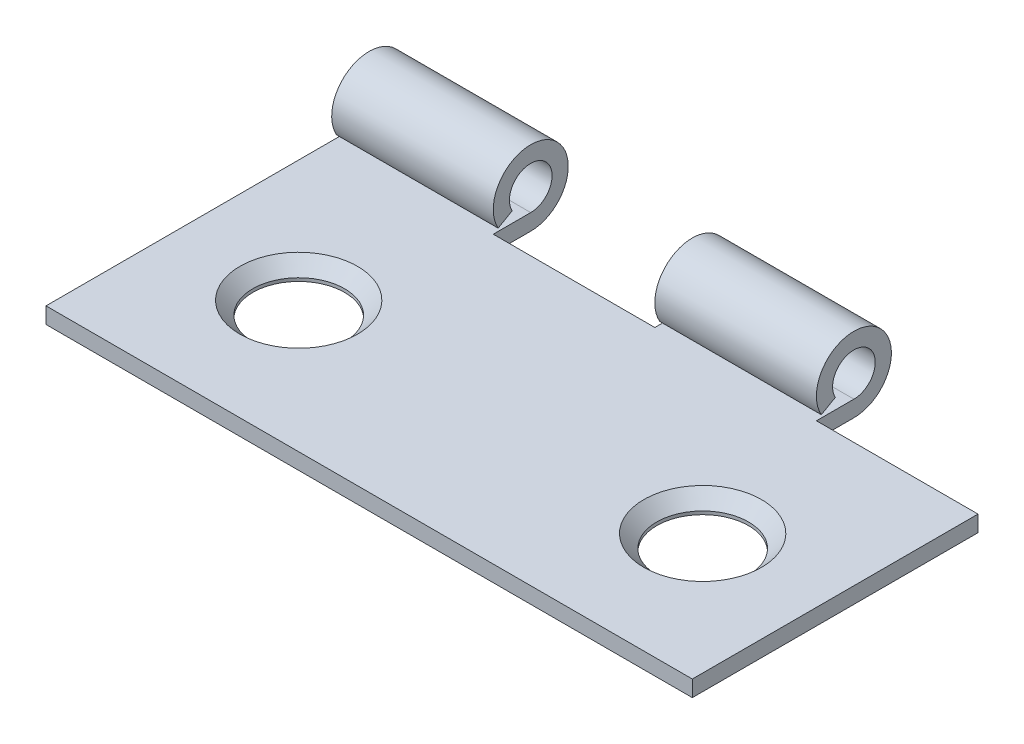
ISO-10303-21;
HEADER;
FILE_DESCRIPTION(('STEP AP214'),'2;1');
FILE_NAME('part.step','',(''),(''),'','','');
FILE_SCHEMA(('AUTOMOTIVE_DESIGN { 1 0 10303 214 1 1 1 1 }'));
ENDSEC;
DATA;
#1=APPLICATION_CONTEXT('core data for automotive mechanical design processes');
#2=APPLICATION_PROTOCOL_DEFINITION('international standard','automotive_design',2000,#1);
#3=PRODUCT_CONTEXT('',#1,'mechanical');
#4=PRODUCT('Part','Part','',(#3));
#5=PRODUCT_RELATED_PRODUCT_CATEGORY('part','',(#4));
#6=PRODUCT_DEFINITION_FORMATION('','',#4);
#7=PRODUCT_DEFINITION_CONTEXT('part definition',#1,'design');
#8=PRODUCT_DEFINITION('design','',#6,#7);
#9=PRODUCT_DEFINITION_SHAPE('','',#8);
#10=(LENGTH_UNIT() NAMED_UNIT(*) SI_UNIT(.MILLI.,.METRE.));
#11=(NAMED_UNIT(*) PLANE_ANGLE_UNIT() SI_UNIT($,.RADIAN.));
#12=(NAMED_UNIT(*) SI_UNIT($,.STERADIAN.) SOLID_ANGLE_UNIT());
#13=UNCERTAINTY_MEASURE_WITH_UNIT(LENGTH_MEASURE(1.E-05),#10,'distance_accuracy_value','');
#14=(GEOMETRIC_REPRESENTATION_CONTEXT(3) GLOBAL_UNCERTAINTY_ASSIGNED_CONTEXT((#13)) GLOBAL_UNIT_ASSIGNED_CONTEXT((#10,
#11,#12)) REPRESENTATION_CONTEXT('',''));
#15=CARTESIAN_POINT('',(0.,0.,0.));
#16=DIRECTION('',(0.,0.,1.));
#17=DIRECTION('',(1.,0.,0.));
#18=AXIS2_PLACEMENT_3D('',#15,#16,#17);
#19=CARTESIAN_POINT('',(12.7000000000001,0.,0.));
#20=DIRECTION('',(-1.,0.,0.));
#21=DIRECTION('',(0.,0.,1.));
#22=AXIS2_PLACEMENT_3D('',#19,#20,#21);
#23=CYLINDRICAL_SURFACE('',#22,1.47320000000008);
#24=CARTESIAN_POINT('',(6.35000000000011,0.,0.));
#25=DIRECTION('',(-1.,0.,0.));
#26=DIRECTION('',(0.,0.,1.));
#27=AXIS2_PLACEMENT_3D('',#24,#25,#26);
#28=CIRCLE('',#27,1.47320000000008);
#29=CARTESIAN_POINT('',(6.35000000000002,-0.728533124002562,1.28045215733778));
#30=VERTEX_POINT('',#29);
#31=CARTESIAN_POINT('',(6.34999999999999,-1.47320000000001,0.));
#32=VERTEX_POINT('',#31);
#33=EDGE_CURVE('E181',#30,#32,#28,.T.);
#34=ORIENTED_EDGE('',*,*,#33,.T.);
#35=DIRECTION('',(-1.,0.,0.));
#36=VECTOR('',#35,1.);
#37=CARTESIAN_POINT('',(12.7,-1.47320000000015,0.));
#38=LINE('',#37,#36);
#39=CARTESIAN_POINT('',(0.,-1.47320000000001,-1.04083408558608E-13));
#40=VERTEX_POINT('',#39);
#41=EDGE_CURVE('E164',#32,#40,#38,.T.);
#42=ORIENTED_EDGE('',*,*,#41,.T.);
#43=CARTESIAN_POINT('',(0.,0.,0.));
#44=DIRECTION('',(1.,0.,0.));
#45=DIRECTION('',(0.,0.,-1.));
#46=AXIS2_PLACEMENT_3D('',#43,#44,#45);
#47=CIRCLE('',#46,1.47320000000008);
#48=CARTESIAN_POINT('',(0.,-0.728533124002562,1.28045215733781));
#49=VERTEX_POINT('',#48);
#50=EDGE_CURVE('E205',#40,#49,#47,.T.);
#51=ORIENTED_EDGE('',*,*,#50,.T.);
#52=DIRECTION('',(-1.,0.,0.));
#53=VECTOR('',#52,1.);
#54=CARTESIAN_POINT('',(12.7,-0.728533124002673,1.28045215733781));
#55=LINE('',#54,#53);
#56=EDGE_CURVE('E242',#30,#49,#55,.T.);
#57=ORIENTED_EDGE('',*,*,#56,.F.);
#58=EDGE_LOOP('',(#34,#42,#51,#57));
#59=FACE_BOUND('',#58,.T.);
#60=ADVANCED_FACE('F42',(#59),#23,.T.);
#61=CARTESIAN_POINT('',(12.7,0.,0.));
#62=DIRECTION('',(-1.,0.,0.));
#63=DIRECTION('',(0.,0.,1.));
#64=AXIS2_PLACEMENT_3D('',#61,#62,#63);
#65=CYLINDRICAL_SURFACE('',#64,0.8382);
#66=DIRECTION('',(-1.,0.,0.));
#67=VECTOR('',#66,1.);
#68=CARTESIAN_POINT('',(12.7,-0.838200000000011,0.));
#69=LINE('',#68,#67);
#70=CARTESIAN_POINT('',(6.35000000000011,-0.838200000000011,0.));
#71=VERTEX_POINT('',#70);
#72=CARTESIAN_POINT('',(0.,-0.838200000000011,0.));
#73=VERTEX_POINT('',#72);
#74=EDGE_CURVE('E253',#71,#73,#69,.T.);
#75=ORIENTED_EDGE('',*,*,#74,.F.);
#76=CARTESIAN_POINT('',(6.34999999999999,0.,0.));
#77=DIRECTION('',(-1.,0.,0.));
#78=DIRECTION('',(0.,0.,1.));
#79=AXIS2_PLACEMENT_3D('',#76,#77,#78);
#80=CIRCLE('',#79,0.8382);
#81=CARTESIAN_POINT('',(6.35000000000005,-0.414510225725584,0.728533124002506));
#82=VERTEX_POINT('',#81);
#83=EDGE_CURVE('E175',#71,#82,#80,.F.);
#84=ORIENTED_EDGE('',*,*,#83,.T.);
#85=DIRECTION('',(-1.,0.,0.));
#86=VECTOR('',#85,1.);
#87=CARTESIAN_POINT('',(12.7,-0.414510225725584,0.728533124002541));
#88=LINE('',#87,#86);
#89=CARTESIAN_POINT('',(0.,-0.414510225725723,0.728533124002562));
#90=VERTEX_POINT('',#89);
#91=EDGE_CURVE('E239',#82,#90,#88,.T.);
#92=ORIENTED_EDGE('',*,*,#91,.T.);
#93=CARTESIAN_POINT('',(0.,0.,0.));
#94=DIRECTION('',(1.,0.,0.));
#95=DIRECTION('',(0.,0.,-1.));
#96=AXIS2_PLACEMENT_3D('',#93,#94,#95);
#97=CIRCLE('',#96,0.8382);
#98=EDGE_CURVE('E204',#90,#73,#97,.F.);
#99=ORIENTED_EDGE('',*,*,#98,.T.);
#100=EDGE_LOOP('',(#75,#84,#92,#99));
#101=FACE_BOUND('',#100,.T.);
#102=ADVANCED_FACE('F328',(#101),#65,.F.);
#103=CARTESIAN_POINT('',(12.7,-0.414510225725584,0.728533124002541));
#104=DIRECTION('',(0.,0.869163832024043,0.494524249255059));
#105=DIRECTION('',(0.,-0.49452424925506,0.869163832024044));
#106=AXIS2_PLACEMENT_3D('',#103,#104,#105);
#107=PLANE('',#106);
#108=ORIENTED_EDGE('',*,*,#91,.F.);
#109=DIRECTION('',(0.,-0.49452424925506,0.869163832024044));
#110=VECTOR('',#109,1.);
#111=CARTESIAN_POINT('',(6.35000000000005,-0.414510225725584,0.728533124002506));
#112=LINE('',#111,#110);
#113=EDGE_CURVE('E178',#82,#30,#112,.T.);
#114=ORIENTED_EDGE('',*,*,#113,.T.);
#115=ORIENTED_EDGE('',*,*,#56,.T.);
#116=DIRECTION('',(0.,0.49452424925506,-0.869163832024044));
#117=VECTOR('',#116,1.);
#118=CARTESIAN_POINT('',(0.,-0.414510225725723,0.728533124002562));
#119=LINE('',#118,#117);
#120=EDGE_CURVE('E11',#49,#90,#119,.T.);
#121=ORIENTED_EDGE('',*,*,#120,.T.);
#122=EDGE_LOOP('',(#108,#114,#115,#121));
#123=FACE_BOUND('',#122,.T.);
#124=ADVANCED_FACE('F325',(#123),#107,.F.);
#125=CARTESIAN_POINT('',(-6.34999999999995,-0.838200000000011,0.));
#126=VERTEX_POINT('',#125);
#127=CARTESIAN_POINT('',(-12.7,-0.838200000000011,0.));
#128=VERTEX_POINT('',#127);
#129=EDGE_CURVE('E252',#126,#128,#69,.T.);
#130=ORIENTED_EDGE('',*,*,#129,.F.);
#131=CARTESIAN_POINT('',(-6.35000000000001,0.,0.));
#132=DIRECTION('',(-1.,0.,0.));
#133=DIRECTION('',(0.,0.,1.));
#134=AXIS2_PLACEMENT_3D('',#131,#132,#133);
#135=CIRCLE('',#134,0.8382);
#136=CARTESIAN_POINT('',(-6.34999999999993,-0.414510225725584,0.728533124002478));
#137=VERTEX_POINT('',#136);
#138=EDGE_CURVE('E195',#126,#137,#135,.F.);
#139=ORIENTED_EDGE('',*,*,#138,.T.);
#140=CARTESIAN_POINT('',(-12.7,-0.414510225725612,0.728533124002513));
#141=VERTEX_POINT('',#140);
#142=EDGE_CURVE('E224',#137,#141,#88,.T.);
#143=ORIENTED_EDGE('',*,*,#142,.T.);
#144=CARTESIAN_POINT('',(-12.6999999999999,-1.38777878078145E-13,0.));
#145=DIRECTION('',(-1.,0.,0.));
#146=DIRECTION('',(0.,0.,1.));
#147=AXIS2_PLACEMENT_3D('',#144,#145,#146);
#148=CIRCLE('',#147,0.8382);
#149=EDGE_CURVE('E216',#141,#128,#148,.T.);
#150=ORIENTED_EDGE('',*,*,#149,.T.);
#151=EDGE_LOOP('',(#130,#139,#143,#150));
#152=FACE_BOUND('',#151,.T.);
#153=ADVANCED_FACE('F44',(#152),#65,.F.);
#154=CARTESIAN_POINT('',(12.7000000000001,-0.838200000000039,12.7));
#155=DIRECTION('',(0.,-1.,0.));
#156=DIRECTION('',(0.,0.,-1.));
#157=AXIS2_PLACEMENT_3D('',#154,#155,#156);
#158=PLANE('',#157);
#159=CARTESIAN_POINT('',(7.95019999999999,-0.83820000000015,7.54379999999996));
#160=DIRECTION('',(0.,1.,0.));
#161=DIRECTION('',(0.,0.,1.));
#162=AXIS2_PLACEMENT_3D('',#159,#160,#161);
#163=CIRCLE('',#162,2.3114);
#164=CARTESIAN_POINT('',(7.95019999999999,-0.83820000000015,9.85519999999996));
#165=VERTEX_POINT('',#164);
#166=EDGE_CURVE('E165',#165,#165,#163,.T.);
#167=ORIENTED_EDGE('',*,*,#166,.F.);
#168=EDGE_LOOP('',(#167));
#169=FACE_BOUND('',#168,.T.);
#170=CARTESIAN_POINT('',(-7.92479999999995,-0.838200000000011,7.54379999999995));
#171=DIRECTION('',(0.,1.,0.));
#172=DIRECTION('',(0.,0.,1.));
#173=AXIS2_PLACEMENT_3D('',#170,#171,#172);
#174=CIRCLE('',#173,2.3114);
#175=CARTESIAN_POINT('',(-7.92479999999995,-0.838200000000011,9.85519999999995));
#176=VERTEX_POINT('',#175);
#177=EDGE_CURVE('E168',#176,#176,#174,.T.);
#178=ORIENTED_EDGE('',*,*,#177,.F.);
#179=EDGE_LOOP('',(#178));
#180=FACE_BOUND('',#179,.T.);
#181=DIRECTION('',(0.,0.,1.));
#182=VECTOR('',#181,1.);
#183=CARTESIAN_POINT('',(12.7000000000001,-0.838200000000039,12.7));
#184=LINE('',#183,#182);
#185=CARTESIAN_POINT('',(12.7000000000001,-0.838200000000067,1.47320000000006));
#186=VERTEX_POINT('',#185);
#187=CARTESIAN_POINT('',(12.7000000000001,-0.838200000000039,12.7));
#188=VERTEX_POINT('',#187);
#189=EDGE_CURVE('E217',#186,#188,#184,.T.);
#190=ORIENTED_EDGE('',*,*,#189,.F.);
#191=DIRECTION('',(-1.,0.,0.));
#192=VECTOR('',#191,1.);
#193=CARTESIAN_POINT('',(12.7000000000001,-0.838200000000067,1.47320000000006));
#194=LINE('',#193,#192);
#195=CARTESIAN_POINT('',(6.35000000000005,-0.838200000000039,1.4732000000001));
#196=VERTEX_POINT('',#195);
#197=EDGE_CURVE('E59',#186,#196,#194,.T.);
#198=ORIENTED_EDGE('',*,*,#197,.T.);
#199=DIRECTION('',(0.,0.,-1.));
#200=VECTOR('',#199,1.);
#201=CARTESIAN_POINT('',(6.34999999999999,-0.838200000000011,12.7));
#202=LINE('',#201,#200);
#203=EDGE_CURVE('E152',#196,#71,#202,.T.);
#204=ORIENTED_EDGE('',*,*,#203,.T.);
#205=ORIENTED_EDGE('',*,*,#74,.T.);
#206=DIRECTION('',(0.,0.,1.));
#207=VECTOR('',#206,1.);
#208=CARTESIAN_POINT('',(0.,-0.838200000000122,12.6999999999999));
#209=LINE('',#208,#207);
#210=CARTESIAN_POINT('',(0.,-0.838199999999872,1.47320000000007));
#211=VERTEX_POINT('',#210);
#212=EDGE_CURVE('E208',#73,#211,#209,.T.);
#213=ORIENTED_EDGE('',*,*,#212,.T.);
#214=DIRECTION('',(-1.,0.,0.));
#215=VECTOR('',#214,1.);
#216=CARTESIAN_POINT('',(12.7000000000001,-0.838200000000067,1.47320000000006));
#217=LINE('',#216,#215);
#218=CARTESIAN_POINT('',(-6.3499999999999,-0.838200000000011,1.47320000000007));
#219=VERTEX_POINT('',#218);
#220=EDGE_CURVE('E213',#211,#219,#217,.T.);
#221=ORIENTED_EDGE('',*,*,#220,.T.);
#222=DIRECTION('',(0.,0.,-1.));
#223=VECTOR('',#222,1.);
#224=CARTESIAN_POINT('',(-6.34999999999999,-0.838199999999983,12.6999999999999));
#225=LINE('',#224,#223);
#226=EDGE_CURVE('E199',#219,#126,#225,.T.);
#227=ORIENTED_EDGE('',*,*,#226,.T.);
#228=ORIENTED_EDGE('',*,*,#129,.T.);
#229=DIRECTION('',(0.,0.,1.));
#230=VECTOR('',#229,1.);
#231=CARTESIAN_POINT('',(-12.7,-0.838199999999983,12.6999999999999));
#232=LINE('',#231,#230);
#233=CARTESIAN_POINT('',(-12.7,-0.838199999999983,12.6999999999999));
#234=VERTEX_POINT('',#233);
#235=EDGE_CURVE('E227',#128,#234,#232,.T.);
#236=ORIENTED_EDGE('',*,*,#235,.T.);
#237=DIRECTION('',(-1.,0.,0.));
#238=VECTOR('',#237,1.);
#239=CARTESIAN_POINT('',(12.7000000000001,-0.838200000000039,12.7));
#240=LINE('',#239,#238);
#241=EDGE_CURVE('E249',#188,#234,#240,.T.);
#242=ORIENTED_EDGE('',*,*,#241,.F.);
#243=EDGE_LOOP('',(#190,#198,#204,#205,#213,#221,#227,#228,#236,#242));
#244=FACE_BOUND('',#243,.T.);
#245=ADVANCED_FACE('F286',(#169,#180,#244),#158,.F.);
#246=CARTESIAN_POINT('',(12.7,-1.47319999999998,12.7));
#247=DIRECTION('',(0.,0.,-1.));
#248=DIRECTION('',(-1.,0.,0.));
#249=AXIS2_PLACEMENT_3D('',#246,#247,#248);
#250=PLANE('',#249);
#251=DIRECTION('',(0.,-1.,0.));
#252=VECTOR('',#251,1.);
#253=CARTESIAN_POINT('',(-12.6999999999999,-1.47320000000001,12.6999999999999));
#254=LINE('',#253,#252);
#255=CARTESIAN_POINT('',(-12.6999999999999,-1.47320000000001,12.6999999999999));
#256=VERTEX_POINT('',#255);
#257=EDGE_CURVE('E229',#234,#256,#254,.T.);
#258=ORIENTED_EDGE('',*,*,#257,.T.);
#259=DIRECTION('',(-1.,0.,0.));
#260=VECTOR('',#259,1.);
#261=CARTESIAN_POINT('',(12.7,-1.47319999999998,12.7));
#262=LINE('',#261,#260);
#263=CARTESIAN_POINT('',(12.7,-1.47319999999998,12.7));
#264=VERTEX_POINT('',#263);
#265=EDGE_CURVE('E246',#264,#256,#262,.T.);
#266=ORIENTED_EDGE('',*,*,#265,.F.);
#267=DIRECTION('',(0.,-1.,0.));
#268=VECTOR('',#267,1.);
#269=CARTESIAN_POINT('',(12.7,-1.47319999999998,12.7));
#270=LINE('',#269,#268);
#271=EDGE_CURVE('E219',#188,#264,#270,.T.);
#272=ORIENTED_EDGE('',*,*,#271,.F.);
#273=ORIENTED_EDGE('',*,*,#241,.T.);
#274=EDGE_LOOP('',(#258,#266,#272,#273));
#275=FACE_BOUND('',#274,.T.);
#276=ADVANCED_FACE('F289',(#275),#250,.F.);
#277=CARTESIAN_POINT('',(12.7,-1.47320000000015,0.));
#278=DIRECTION('',(0.,1.,0.));
#279=DIRECTION('',(0.,0.,1.));
#280=AXIS2_PLACEMENT_3D('',#277,#278,#279);
#281=PLANE('',#280);
#282=CARTESIAN_POINT('',(7.95020000000002,-1.47320000000001,7.54379999999997));
#283=DIRECTION('',(0.,1.,0.));
#284=DIRECTION('',(0.,0.,1.));
#285=AXIS2_PLACEMENT_3D('',#282,#283,#284);
#286=CIRCLE('',#285,1.8034);
#287=CARTESIAN_POINT('',(7.95020000000002,-1.47320000000001,9.34719999999997));
#288=VERTEX_POINT('',#287);
#289=EDGE_CURVE('E257',#288,#288,#286,.T.);
#290=ORIENTED_EDGE('',*,*,#289,.T.);
#291=EDGE_LOOP('',(#290));
#292=FACE_BOUND('',#291,.T.);
#293=CARTESIAN_POINT('',(-7.92479999999995,-1.47320000000001,7.54379999999999));
#294=DIRECTION('',(0.,1.,0.));
#295=DIRECTION('',(0.,0.,1.));
#296=AXIS2_PLACEMENT_3D('',#293,#294,#295);
#297=CIRCLE('',#296,1.8034);
#298=CARTESIAN_POINT('',(-7.92479999999995,-1.47320000000001,9.34719999999999));
#299=VERTEX_POINT('',#298);
#300=EDGE_CURVE('E262',#299,#299,#297,.T.);
#301=ORIENTED_EDGE('',*,*,#300,.T.);
#302=EDGE_LOOP('',(#301));
#303=FACE_BOUND('',#302,.T.);
#304=DIRECTION('',(0.,0.,1.));
#305=VECTOR('',#304,1.);
#306=CARTESIAN_POINT('',(6.35000000000008,-1.47320000000001,1.47320000000006));
#307=LINE('',#306,#305);
#308=CARTESIAN_POINT('',(6.35000000000008,-1.47320000000001,1.47320000000006));
#309=VERTEX_POINT('',#308);
#310=EDGE_CURVE('E149',#32,#309,#307,.T.);
#311=ORIENTED_EDGE('',*,*,#310,.T.);
#312=DIRECTION('',(1.,0.,0.));
#313=VECTOR('',#312,1.);
#314=CARTESIAN_POINT('',(12.7,-1.47320000000001,1.47320000000006));
#315=LINE('',#314,#313);
#316=CARTESIAN_POINT('',(12.7,-1.47320000000001,1.47320000000006));
#317=VERTEX_POINT('',#316);
#318=EDGE_CURVE('E154',#309,#317,#315,.T.);
#319=ORIENTED_EDGE('',*,*,#318,.T.);
#320=DIRECTION('',(0.,0.,-1.));
#321=VECTOR('',#320,1.);
#322=CARTESIAN_POINT('',(12.7,-1.47320000000015,0.));
#323=LINE('',#322,#321);
#324=EDGE_CURVE('E222',#264,#317,#323,.T.);
#325=ORIENTED_EDGE('',*,*,#324,.F.);
#326=ORIENTED_EDGE('',*,*,#265,.T.);
#327=DIRECTION('',(0.,0.,-1.));
#328=VECTOR('',#327,1.);
#329=CARTESIAN_POINT('',(-12.7,-1.47319999999998,0.));
#330=LINE('',#329,#328);
#331=CARTESIAN_POINT('',(-12.7,-1.47319999999998,0.));
#332=VERTEX_POINT('',#331);
#333=EDGE_CURVE('E231',#256,#332,#330,.T.);
#334=ORIENTED_EDGE('',*,*,#333,.T.);
#335=CARTESIAN_POINT('',(-6.34999999999999,-1.47320000000012,0.));
#336=VERTEX_POINT('',#335);
#337=EDGE_CURVE('E244',#336,#332,#38,.T.);
#338=ORIENTED_EDGE('',*,*,#337,.F.);
#339=DIRECTION('',(0.,0.,1.));
#340=VECTOR('',#339,1.);
#341=CARTESIAN_POINT('',(-6.34999999999999,-1.47320000000001,1.47320000000006));
#342=LINE('',#341,#340);
#343=CARTESIAN_POINT('',(-6.34999999999999,-1.47320000000001,1.47320000000006));
#344=VERTEX_POINT('',#343);
#345=EDGE_CURVE('E185',#336,#344,#342,.T.);
#346=ORIENTED_EDGE('',*,*,#345,.T.);
#347=DIRECTION('',(1.,0.,0.));
#348=VECTOR('',#347,1.);
#349=CARTESIAN_POINT('',(0.,-1.47320000000001,1.47320000000008));
#350=LINE('',#349,#348);
#351=CARTESIAN_POINT('',(0.,-1.47320000000001,1.47320000000008));
#352=VERTEX_POINT('',#351);
#353=EDGE_CURVE('E188',#344,#352,#350,.T.);
#354=ORIENTED_EDGE('',*,*,#353,.T.);
#355=DIRECTION('',(0.,0.,-1.));
#356=VECTOR('',#355,1.);
#357=CARTESIAN_POINT('',(0.,-1.47320000000012,-1.4732000000002));
#358=LINE('',#357,#356);
#359=EDGE_CURVE('E183',#352,#40,#358,.T.);
#360=ORIENTED_EDGE('',*,*,#359,.T.);
#361=ORIENTED_EDGE('',*,*,#41,.F.);
#362=EDGE_LOOP('',(#311,#319,#325,#326,#334,#338,#346,#354,#360,#361));
#363=FACE_BOUND('',#362,.T.);
#364=ADVANCED_FACE('F162',(#292,#303,#363),#281,.F.);
#365=CARTESIAN_POINT('',(-6.34999999999999,-0.728533124002562,1.28045215733776));
#366=VERTEX_POINT('',#365);
#367=CARTESIAN_POINT('',(-12.7,-0.728533124002562,1.28045215733782));
#368=VERTEX_POINT('',#367);
#369=EDGE_CURVE('E241',#366,#368,#55,.T.);
#370=ORIENTED_EDGE('',*,*,#369,.F.);
#371=CARTESIAN_POINT('',(-6.34999999999998,0.,0.));
#372=DIRECTION('',(-1.,0.,0.));
#373=DIRECTION('',(0.,0.,1.));
#374=AXIS2_PLACEMENT_3D('',#371,#372,#373);
#375=CIRCLE('',#374,1.47320000000008);
#376=EDGE_CURVE('E67',#366,#336,#375,.T.);
#377=ORIENTED_EDGE('',*,*,#376,.T.);
#378=ORIENTED_EDGE('',*,*,#337,.T.);
#379=CARTESIAN_POINT('',(-12.7,0.,-1.17961196366423E-13));
#380=DIRECTION('',(1.,0.,0.));
#381=DIRECTION('',(0.,0.,1.));
#382=AXIS2_PLACEMENT_3D('',#379,#380,#381);
#383=CIRCLE('',#382,1.47320000000008);
#384=EDGE_CURVE('E234',#332,#368,#383,.T.);
#385=ORIENTED_EDGE('',*,*,#384,.T.);
#386=EDGE_LOOP('',(#370,#377,#378,#385));
#387=FACE_BOUND('',#386,.T.);
#388=ADVANCED_FACE('F309',(#387),#23,.T.);
#389=ORIENTED_EDGE('',*,*,#142,.F.);
#390=DIRECTION('',(0.,-0.49452424925506,0.869163832024044));
#391=VECTOR('',#390,1.);
#392=CARTESIAN_POINT('',(-6.34999999999993,-0.414510225725584,0.728533124002478));
#393=LINE('',#392,#391);
#394=EDGE_CURVE('E51',#137,#366,#393,.T.);
#395=ORIENTED_EDGE('',*,*,#394,.T.);
#396=ORIENTED_EDGE('',*,*,#369,.T.);
#397=DIRECTION('',(0.,0.49452424925506,-0.869163832024044));
#398=VECTOR('',#397,1.);
#399=CARTESIAN_POINT('',(-12.7,-0.414510225725612,0.728533124002513));
#400=LINE('',#399,#398);
#401=EDGE_CURVE('E220',#368,#141,#400,.T.);
#402=ORIENTED_EDGE('',*,*,#401,.T.);
#403=EDGE_LOOP('',(#389,#395,#396,#402));
#404=FACE_BOUND('',#403,.T.);
#405=ADVANCED_FACE('F345',(#404),#107,.F.);
#406=CARTESIAN_POINT('',(12.7,0.,0.));
#407=DIRECTION('',(-1.,0.,0.));
#408=DIRECTION('',(0.,0.,1.));
#409=AXIS2_PLACEMENT_3D('',#406,#407,#408);
#410=PLANE('',#409);
#411=ORIENTED_EDGE('',*,*,#324,.T.);
#412=DIRECTION('',(0.,1.,0.));
#413=VECTOR('',#412,1.);
#414=CARTESIAN_POINT('',(12.7,-1.47320000000001,1.47320000000006));
#415=LINE('',#414,#413);
#416=EDGE_CURVE('E153',#317,#186,#415,.T.);
#417=ORIENTED_EDGE('',*,*,#416,.T.);
#418=ORIENTED_EDGE('',*,*,#189,.T.);
#419=ORIENTED_EDGE('',*,*,#271,.T.);
#420=EDGE_LOOP('',(#411,#417,#418,#419));
#421=FACE_BOUND('',#420,.T.);
#422=ADVANCED_FACE('F295',(#421),#410,.F.);
#423=CARTESIAN_POINT('',(-12.6999999999999,-1.38777878078145E-13,0.));
#424=DIRECTION('',(-1.,0.,0.));
#425=DIRECTION('',(0.,0.,1.));
#426=AXIS2_PLACEMENT_3D('',#423,#424,#425);
#427=PLANE('',#426);
#428=ORIENTED_EDGE('',*,*,#149,.F.);
#429=ORIENTED_EDGE('',*,*,#401,.F.);
#430=ORIENTED_EDGE('',*,*,#384,.F.);
#431=ORIENTED_EDGE('',*,*,#333,.F.);
#432=ORIENTED_EDGE('',*,*,#257,.F.);
#433=ORIENTED_EDGE('',*,*,#235,.F.);
#434=EDGE_LOOP('',(#428,#429,#430,#431,#432,#433));
#435=FACE_BOUND('',#434,.T.);
#436=ADVANCED_FACE('F304',(#435),#427,.T.);
#437=CARTESIAN_POINT('',(0.,-1.47320000000001,1.47320000000008));
#438=DIRECTION('',(0.,0.,1.));
#439=DIRECTION('',(1.,0.,0.));
#440=AXIS2_PLACEMENT_3D('',#437,#438,#439);
#441=PLANE('',#440);
#442=DIRECTION('',(0.,1.,0.));
#443=VECTOR('',#442,1.);
#444=CARTESIAN_POINT('',(0.,-1.47320000000001,1.47320000000008));
#445=LINE('',#444,#443);
#446=EDGE_CURVE('E192',#352,#211,#445,.T.);
#447=ORIENTED_EDGE('',*,*,#446,.F.);
#448=ORIENTED_EDGE('',*,*,#353,.F.);
#449=DIRECTION('',(0.,1.,0.));
#450=VECTOR('',#449,1.);
#451=CARTESIAN_POINT('',(-6.34999999999999,-1.47320000000001,1.47320000000006));
#452=LINE('',#451,#450);
#453=EDGE_CURVE('E191',#344,#219,#452,.T.);
#454=ORIENTED_EDGE('',*,*,#453,.T.);
#455=ORIENTED_EDGE('',*,*,#220,.F.);
#456=EDGE_LOOP('',(#447,#448,#454,#455));
#457=FACE_BOUND('',#456,.T.);
#458=ADVANCED_FACE('F313',(#457),#441,.F.);
#459=CARTESIAN_POINT('',(0.,-1.47320000000012,-1.4732000000002));
#460=DIRECTION('',(1.,0.,0.));
#461=DIRECTION('',(0.,0.,-1.));
#462=AXIS2_PLACEMENT_3D('',#459,#460,#461);
#463=PLANE('',#462);
#464=ORIENTED_EDGE('',*,*,#98,.F.);
#465=ORIENTED_EDGE('',*,*,#120,.F.);
#466=ORIENTED_EDGE('',*,*,#50,.F.);
#467=ORIENTED_EDGE('',*,*,#359,.F.);
#468=ORIENTED_EDGE('',*,*,#446,.T.);
#469=ORIENTED_EDGE('',*,*,#212,.F.);
#470=EDGE_LOOP('',(#464,#465,#466,#467,#468,#469));
#471=FACE_BOUND('',#470,.T.);
#472=ADVANCED_FACE('F319',(#471),#463,.F.);
#473=CARTESIAN_POINT('',(-6.34999999999999,-1.47320000000001,1.47320000000006));
#474=DIRECTION('',(-1.,0.,0.));
#475=DIRECTION('',(0.,0.,1.));
#476=AXIS2_PLACEMENT_3D('',#473,#474,#475);
#477=PLANE('',#476);
#478=ORIENTED_EDGE('',*,*,#376,.F.);
#479=ORIENTED_EDGE('',*,*,#394,.F.);
#480=ORIENTED_EDGE('',*,*,#138,.F.);
#481=ORIENTED_EDGE('',*,*,#226,.F.);
#482=ORIENTED_EDGE('',*,*,#453,.F.);
#483=ORIENTED_EDGE('',*,*,#345,.F.);
#484=EDGE_LOOP('',(#478,#479,#480,#481,#482,#483));
#485=FACE_BOUND('',#484,.T.);
#486=ADVANCED_FACE('F311',(#485),#477,.F.);
#487=CARTESIAN_POINT('',(6.35000000000008,-1.47320000000001,1.47320000000006));
#488=DIRECTION('',(-1.,0.,0.));
#489=DIRECTION('',(0.,0.,1.));
#490=AXIS2_PLACEMENT_3D('',#487,#488,#489);
#491=PLANE('',#490);
#492=ORIENTED_EDGE('',*,*,#33,.F.);
#493=ORIENTED_EDGE('',*,*,#113,.F.);
#494=ORIENTED_EDGE('',*,*,#83,.F.);
#495=ORIENTED_EDGE('',*,*,#203,.F.);
#496=DIRECTION('',(0.,1.,0.));
#497=VECTOR('',#496,1.);
#498=CARTESIAN_POINT('',(6.35000000000008,-1.47320000000001,1.47320000000006));
#499=LINE('',#498,#497);
#500=EDGE_CURVE('E145',#309,#196,#499,.T.);
#501=ORIENTED_EDGE('',*,*,#500,.F.);
#502=ORIENTED_EDGE('',*,*,#310,.F.);
#503=EDGE_LOOP('',(#492,#493,#494,#495,#501,#502));
#504=FACE_BOUND('',#503,.T.);
#505=ADVANCED_FACE('F147',(#504),#491,.F.);
#506=CARTESIAN_POINT('',(12.7,-1.47320000000001,1.47320000000006));
#507=DIRECTION('',(0.,0.,1.));
#508=DIRECTION('',(1.,0.,0.));
#509=AXIS2_PLACEMENT_3D('',#506,#507,#508);
#510=PLANE('',#509);
#511=ORIENTED_EDGE('',*,*,#416,.F.);
#512=ORIENTED_EDGE('',*,*,#318,.F.);
#513=ORIENTED_EDGE('',*,*,#500,.T.);
#514=ORIENTED_EDGE('',*,*,#197,.F.);
#515=EDGE_LOOP('',(#511,#512,#513,#514));
#516=FACE_BOUND('',#515,.T.);
#517=ADVANCED_FACE('F157',(#516),#510,.F.);
#518=CARTESIAN_POINT('',(-7.92479999999995,-0.838200000000011,7.54379999999995));
#519=DIRECTION('',(0.,1.,0.));
#520=DIRECTION('',(0.,0.,1.));
#521=AXIS2_PLACEMENT_3D('',#518,#519,#520);
#522=CONICAL_SURFACE('',#521,2.3114,0.78539816339745);
#523=CARTESIAN_POINT('',(-7.9248,-1.34620000000002,7.54379999999998));
#524=DIRECTION('',(0.,1.,0.));
#525=DIRECTION('',(0.,0.,1.));
#526=AXIS2_PLACEMENT_3D('',#523,#524,#525);
#527=CIRCLE('',#526,1.8034);
#528=CARTESIAN_POINT('',(-7.92479999999999,-1.34620000000002,9.34719999999998));
#529=VERTEX_POINT('',#528);
#530=EDGE_CURVE('E46',#529,#529,#527,.F.);
#531=ORIENTED_EDGE('',*,*,#530,.T.);
#532=EDGE_LOOP('',(#531));
#533=FACE_BOUND('',#532,.T.);
#534=ORIENTED_EDGE('',*,*,#177,.T.);
#535=EDGE_LOOP('',(#534));
#536=FACE_BOUND('',#535,.T.);
#537=ADVANCED_FACE('F278',(#533,#536),#522,.F.);
#538=CARTESIAN_POINT('',(7.95019999999999,-0.83820000000015,7.54379999999996));
#539=DIRECTION('',(0.,1.,0.));
#540=DIRECTION('',(0.,0.,1.));
#541=AXIS2_PLACEMENT_3D('',#538,#539,#540);
#542=CONICAL_SURFACE('',#541,2.3114,0.78539816339745);
#543=CARTESIAN_POINT('',(7.95020000000005,-1.34619999999999,7.54379999999996));
#544=DIRECTION('',(0.,1.,0.));
#545=DIRECTION('',(0.,0.,1.));
#546=AXIS2_PLACEMENT_3D('',#543,#544,#545);
#547=CIRCLE('',#546,1.8034);
#548=CARTESIAN_POINT('',(7.95020000000005,-1.34619999999999,9.34719999999996));
#549=VERTEX_POINT('',#548);
#550=EDGE_CURVE('E255',#549,#549,#547,.F.);
#551=ORIENTED_EDGE('',*,*,#550,.T.);
#552=EDGE_LOOP('',(#551));
#553=FACE_BOUND('',#552,.T.);
#554=ORIENTED_EDGE('',*,*,#166,.T.);
#555=EDGE_LOOP('',(#554));
#556=FACE_BOUND('',#555,.T.);
#557=ADVANCED_FACE('F281',(#553,#556),#542,.F.);
#558=CARTESIAN_POINT('',(7.95020000000002,-1.47320000000001,7.54379999999997));
#559=DIRECTION('',(0.,1.,0.));
#560=DIRECTION('',(0.,0.,1.));
#561=AXIS2_PLACEMENT_3D('',#558,#559,#560);
#562=CYLINDRICAL_SURFACE('',#561,1.8034);
#563=ORIENTED_EDGE('',*,*,#289,.F.);
#564=EDGE_LOOP('',(#563));
#565=FACE_BOUND('',#564,.T.);
#566=ORIENTED_EDGE('',*,*,#550,.F.);
#567=EDGE_LOOP('',(#566));
#568=FACE_BOUND('',#567,.T.);
#569=ADVANCED_FACE('F274',(#565,#568),#562,.F.);
#570=CARTESIAN_POINT('',(-7.92479999999995,-1.47320000000001,7.54379999999999));
#571=DIRECTION('',(0.,1.,0.));
#572=DIRECTION('',(0.,0.,1.));
#573=AXIS2_PLACEMENT_3D('',#570,#571,#572);
#574=CYLINDRICAL_SURFACE('',#573,1.8034);
#575=ORIENTED_EDGE('',*,*,#300,.F.);
#576=EDGE_LOOP('',(#575));
#577=FACE_BOUND('',#576,.T.);
#578=ORIENTED_EDGE('',*,*,#530,.F.);
#579=EDGE_LOOP('',(#578));
#580=FACE_BOUND('',#579,.T.);
#581=ADVANCED_FACE('F271',(#577,#580),#574,.F.);
#582=CLOSED_SHELL('',(#60,#102,#124,#153,#245,#276,#364,#388,#405,#422,#436,#458,#472,#486,#505,
#517,#537,#557,#569,#581));
#583=MANIFOLD_SOLID_BREP('B2',#582);
#584=ADVANCED_BREP_SHAPE_REPRESENTATION('',(#18,#583),#14);
#585=SHAPE_DEFINITION_REPRESENTATION(#9,#584);
ENDSEC;
END-ISO-10303-21;
